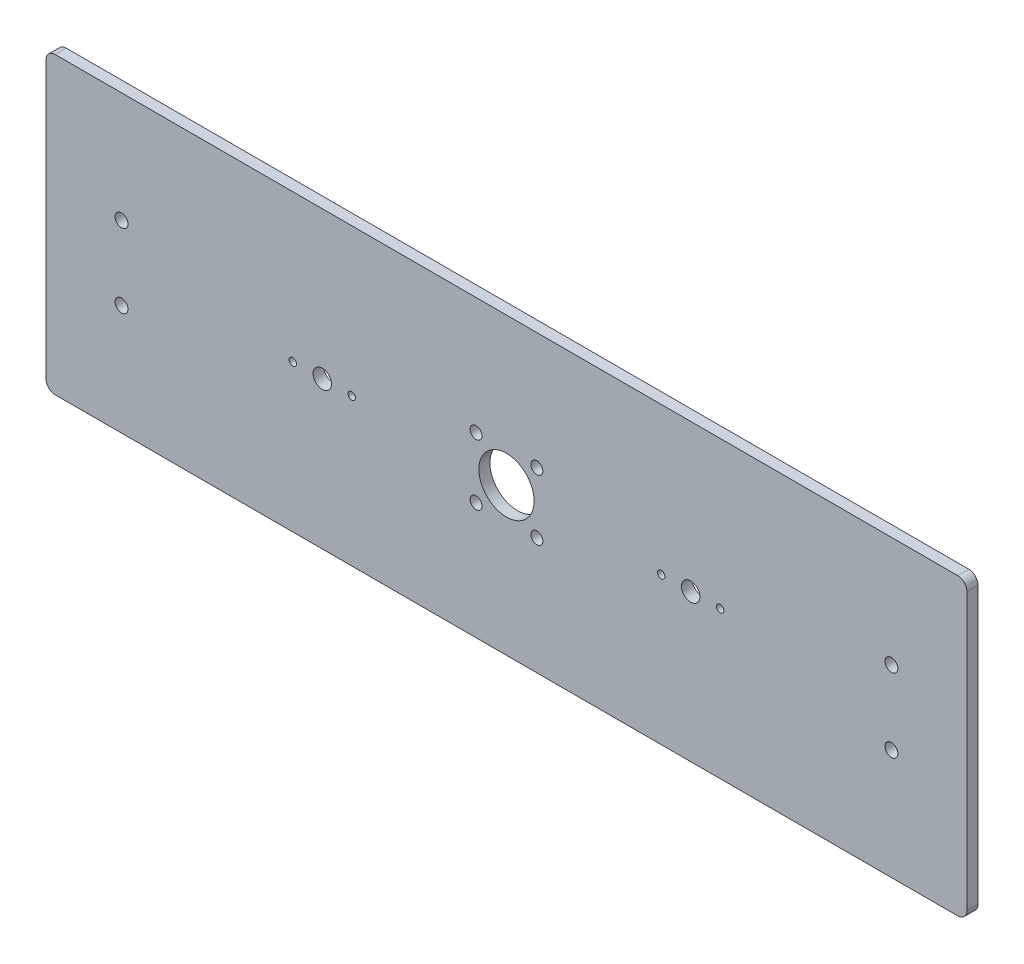
ISO-10303-21;
HEADER;
FILE_DESCRIPTION(('STEP AP214'),'2;1');
FILE_NAME('part.step','',(''),(''),'','','');
FILE_SCHEMA(('AUTOMOTIVE_DESIGN { 1 0 10303 214 1 1 1 1 }'));
ENDSEC;
DATA;
#1=APPLICATION_CONTEXT('core data for automotive mechanical design processes');
#2=APPLICATION_PROTOCOL_DEFINITION('international standard','automotive_design',2000,#1);
#3=PRODUCT_CONTEXT('',#1,'mechanical');
#4=PRODUCT('Part','Part','',(#3));
#5=PRODUCT_RELATED_PRODUCT_CATEGORY('part','',(#4));
#6=PRODUCT_DEFINITION_FORMATION('','',#4);
#7=PRODUCT_DEFINITION_CONTEXT('part definition',#1,'design');
#8=PRODUCT_DEFINITION('design','',#6,#7);
#9=PRODUCT_DEFINITION_SHAPE('','',#8);
#10=(LENGTH_UNIT() NAMED_UNIT(*) SI_UNIT(.MILLI.,.METRE.));
#11=(NAMED_UNIT(*) PLANE_ANGLE_UNIT() SI_UNIT($,.RADIAN.));
#12=(NAMED_UNIT(*) SI_UNIT($,.STERADIAN.) SOLID_ANGLE_UNIT());
#13=UNCERTAINTY_MEASURE_WITH_UNIT(LENGTH_MEASURE(1.E-05),#10,'distance_accuracy_value','');
#14=(GEOMETRIC_REPRESENTATION_CONTEXT(3) GLOBAL_UNCERTAINTY_ASSIGNED_CONTEXT((#13)) GLOBAL_UNIT_ASSIGNED_CONTEXT((#10,
#11,#12)) REPRESENTATION_CONTEXT('',''));
#15=CARTESIAN_POINT('',(0.,0.,0.));
#16=DIRECTION('',(0.,0.,1.));
#17=DIRECTION('',(1.,0.,0.));
#18=AXIS2_PLACEMENT_3D('',#15,#16,#17);
#19=CARTESIAN_POINT('',(0.,-80.,6.));
#20=DIRECTION('',(0.,1.,0.));
#21=DIRECTION('',(0.,0.,1.));
#22=AXIS2_PLACEMENT_3D('',#19,#20,#21);
#23=PLANE('',#22);
#24=DIRECTION('',(1.,0.,0.));
#25=VECTOR('',#24,1.);
#26=CARTESIAN_POINT('',(0.,-80.,6.));
#27=LINE('',#26,#25);
#28=CARTESIAN_POINT('',(-195.,-80.,6.));
#29=VERTEX_POINT('',#28);
#30=CARTESIAN_POINT('',(295.,-80.,6.));
#31=VERTEX_POINT('',#30);
#32=EDGE_CURVE('E123',#29,#31,#27,.T.);
#33=ORIENTED_EDGE('',*,*,#32,.F.);
#34=DIRECTION('',(0.,0.,-1.));
#35=VECTOR('',#34,1.);
#36=CARTESIAN_POINT('',(-195.,-80.,0.));
#37=LINE('',#36,#35);
#38=CARTESIAN_POINT('',(-195.,-80.,0.));
#39=VERTEX_POINT('',#38);
#40=EDGE_CURVE('E108',#29,#39,#37,.T.);
#41=ORIENTED_EDGE('',*,*,#40,.T.);
#42=DIRECTION('',(1.,0.,0.));
#43=VECTOR('',#42,1.);
#44=CARTESIAN_POINT('',(0.,-80.,0.));
#45=LINE('',#44,#43);
#46=CARTESIAN_POINT('',(295.,-80.,0.));
#47=VERTEX_POINT('',#46);
#48=EDGE_CURVE('E120',#39,#47,#45,.T.);
#49=ORIENTED_EDGE('',*,*,#48,.T.);
#50=DIRECTION('',(0.,0.,-1.));
#51=VECTOR('',#50,1.);
#52=CARTESIAN_POINT('',(295.,-80.,6.));
#53=LINE('',#52,#51);
#54=EDGE_CURVE('E125',#47,#31,#53,.F.);
#55=ORIENTED_EDGE('',*,*,#54,.T.);
#56=EDGE_LOOP('',(#33,#41,#49,#55));
#57=FACE_BOUND('',#56,.T.);
#58=ADVANCED_FACE('F38',(#57),#23,.F.);
#59=CARTESIAN_POINT('',(300.,0.,6.));
#60=DIRECTION('',(-1.,0.,0.));
#61=DIRECTION('',(0.,0.,1.));
#62=AXIS2_PLACEMENT_3D('',#59,#60,#61);
#63=PLANE('',#62);
#64=DIRECTION('',(0.,1.,0.));
#65=VECTOR('',#64,1.);
#66=CARTESIAN_POINT('',(300.,0.,6.));
#67=LINE('',#66,#65);
#68=CARTESIAN_POINT('',(300.,-75.,6.));
#69=VERTEX_POINT('',#68);
#70=CARTESIAN_POINT('',(300.,75.,6.));
#71=VERTEX_POINT('',#70);
#72=EDGE_CURVE('E180',#69,#71,#67,.T.);
#73=ORIENTED_EDGE('',*,*,#72,.F.);
#74=DIRECTION('',(0.,0.,-1.));
#75=VECTOR('',#74,1.);
#76=CARTESIAN_POINT('',(300.,-75.,6.));
#77=LINE('',#76,#75);
#78=CARTESIAN_POINT('',(300.,-75.,0.));
#79=VERTEX_POINT('',#78);
#80=EDGE_CURVE('E173',#69,#79,#77,.T.);
#81=ORIENTED_EDGE('',*,*,#80,.T.);
#82=DIRECTION('',(0.,1.,0.));
#83=VECTOR('',#82,1.);
#84=CARTESIAN_POINT('',(300.,0.,0.));
#85=LINE('',#84,#83);
#86=CARTESIAN_POINT('',(300.,75.,0.));
#87=VERTEX_POINT('',#86);
#88=EDGE_CURVE('E130',#79,#87,#85,.T.);
#89=ORIENTED_EDGE('',*,*,#88,.T.);
#90=DIRECTION('',(0.,0.,-1.));
#91=VECTOR('',#90,1.);
#92=CARTESIAN_POINT('',(300.,75.,6.));
#93=LINE('',#92,#91);
#94=EDGE_CURVE('E171',#87,#71,#93,.F.);
#95=ORIENTED_EDGE('',*,*,#94,.T.);
#96=EDGE_LOOP('',(#73,#81,#89,#95));
#97=FACE_BOUND('',#96,.T.);
#98=ADVANCED_FACE('F178',(#97),#63,.F.);
#99=CARTESIAN_POINT('',(0.,80.,6.));
#100=DIRECTION('',(0.,1.,0.));
#101=DIRECTION('',(0.,0.,1.));
#102=AXIS2_PLACEMENT_3D('',#99,#100,#101);
#103=PLANE('',#102);
#104=DIRECTION('',(1.,0.,0.));
#105=VECTOR('',#104,1.);
#106=CARTESIAN_POINT('',(0.,80.,6.));
#107=LINE('',#106,#105);
#108=CARTESIAN_POINT('',(-195.,80.,6.));
#109=VERTEX_POINT('',#108);
#110=CARTESIAN_POINT('',(295.,80.,6.));
#111=VERTEX_POINT('',#110);
#112=EDGE_CURVE('E187',#109,#111,#107,.T.);
#113=ORIENTED_EDGE('',*,*,#112,.T.);
#114=DIRECTION('',(0.,0.,-1.));
#115=VECTOR('',#114,1.);
#116=CARTESIAN_POINT('',(295.,80.,0.));
#117=LINE('',#116,#115);
#118=CARTESIAN_POINT('',(295.,80.,0.));
#119=VERTEX_POINT('',#118);
#120=EDGE_CURVE('E11',#111,#119,#117,.T.);
#121=ORIENTED_EDGE('',*,*,#120,.T.);
#122=DIRECTION('',(1.,0.,0.));
#123=VECTOR('',#122,1.);
#124=CARTESIAN_POINT('',(0.,80.,0.));
#125=LINE('',#124,#123);
#126=CARTESIAN_POINT('',(-195.,80.,0.));
#127=VERTEX_POINT('',#126);
#128=EDGE_CURVE('E134',#127,#119,#125,.T.);
#129=ORIENTED_EDGE('',*,*,#128,.F.);
#130=DIRECTION('',(0.,0.,-1.));
#131=VECTOR('',#130,1.);
#132=CARTESIAN_POINT('',(-195.,80.,6.));
#133=LINE('',#132,#131);
#134=EDGE_CURVE('E46',#127,#109,#133,.F.);
#135=ORIENTED_EDGE('',*,*,#134,.T.);
#136=EDGE_LOOP('',(#113,#121,#129,#135));
#137=FACE_BOUND('',#136,.T.);
#138=ADVANCED_FACE('F186',(#137),#103,.T.);
#139=CARTESIAN_POINT('',(259.,20.,6.));
#140=DIRECTION('',(0.,0.,-1.));
#141=DIRECTION('',(-1.,0.,0.));
#142=AXIS2_PLACEMENT_3D('',#139,#140,#141);
#143=CYLINDRICAL_SURFACE('',#142,3.50000000000002);
#144=CARTESIAN_POINT('',(259.,20.,6.));
#145=DIRECTION('',(0.,0.,1.));
#146=DIRECTION('',(1.,0.,0.));
#147=AXIS2_PLACEMENT_3D('',#144,#145,#146);
#148=CIRCLE('',#147,3.50000000000002);
#149=CARTESIAN_POINT('',(262.5,20.,6.));
#150=VERTEX_POINT('',#149);
#151=EDGE_CURVE('E199',#150,#150,#148,.F.);
#152=ORIENTED_EDGE('',*,*,#151,.F.);
#153=EDGE_LOOP('',(#152));
#154=FACE_BOUND('',#153,.T.);
#155=CARTESIAN_POINT('',(259.,20.,0.));
#156=DIRECTION('',(0.,0.,1.));
#157=DIRECTION('',(1.,0.,0.));
#158=AXIS2_PLACEMENT_3D('',#155,#156,#157);
#159=CIRCLE('',#158,3.50000000000002);
#160=CARTESIAN_POINT('',(262.5,20.,0.));
#161=VERTEX_POINT('',#160);
#162=EDGE_CURVE('E148',#161,#161,#159,.F.);
#163=ORIENTED_EDGE('',*,*,#162,.T.);
#164=EDGE_LOOP('',(#163));
#165=FACE_BOUND('',#164,.T.);
#166=ADVANCED_FACE('F264',(#154,#165),#143,.F.);
#167=CARTESIAN_POINT('',(259.,-20.,6.));
#168=DIRECTION('',(0.,0.,-1.));
#169=DIRECTION('',(-1.,0.,0.));
#170=AXIS2_PLACEMENT_3D('',#167,#168,#169);
#171=CYLINDRICAL_SURFACE('',#170,3.50000000000002);
#172=CARTESIAN_POINT('',(259.,-20.,6.));
#173=DIRECTION('',(0.,0.,1.));
#174=DIRECTION('',(1.,0.,0.));
#175=AXIS2_PLACEMENT_3D('',#172,#173,#174);
#176=CIRCLE('',#175,3.50000000000002);
#177=CARTESIAN_POINT('',(262.5,-20.,6.));
#178=VERTEX_POINT('',#177);
#179=EDGE_CURVE('E192',#178,#178,#176,.T.);
#180=ORIENTED_EDGE('',*,*,#179,.T.);
#181=EDGE_LOOP('',(#180));
#182=FACE_BOUND('',#181,.T.);
#183=CARTESIAN_POINT('',(259.,-20.,0.));
#184=DIRECTION('',(0.,0.,1.));
#185=DIRECTION('',(1.,0.,0.));
#186=AXIS2_PLACEMENT_3D('',#183,#184,#185);
#187=CIRCLE('',#186,3.50000000000002);
#188=CARTESIAN_POINT('',(262.5,-20.,0.));
#189=VERTEX_POINT('',#188);
#190=EDGE_CURVE('E145',#189,#189,#187,.T.);
#191=ORIENTED_EDGE('',*,*,#190,.F.);
#192=EDGE_LOOP('',(#191));
#193=FACE_BOUND('',#192,.T.);
#194=ADVANCED_FACE('F267',(#182,#193),#171,.F.);
#195=CARTESIAN_POINT('',(-200.,0.,6.));
#196=DIRECTION('',(-1.,0.,0.));
#197=DIRECTION('',(0.,0.,1.));
#198=AXIS2_PLACEMENT_3D('',#195,#196,#197);
#199=PLANE('',#198);
#200=DIRECTION('',(0.,1.,0.));
#201=VECTOR('',#200,1.);
#202=CARTESIAN_POINT('',(-200.,0.,0.));
#203=LINE('',#202,#201);
#204=CARTESIAN_POINT('',(-200.,-75.,0.));
#205=VERTEX_POINT('',#204);
#206=CARTESIAN_POINT('',(-200.,75.,0.));
#207=VERTEX_POINT('',#206);
#208=EDGE_CURVE('E143',#205,#207,#203,.T.);
#209=ORIENTED_EDGE('',*,*,#208,.F.);
#210=DIRECTION('',(0.,0.,-1.));
#211=VECTOR('',#210,1.);
#212=CARTESIAN_POINT('',(-200.,-75.,6.));
#213=LINE('',#212,#211);
#214=CARTESIAN_POINT('',(-200.,-75.,6.));
#215=VERTEX_POINT('',#214);
#216=EDGE_CURVE('E109',#205,#215,#213,.F.);
#217=ORIENTED_EDGE('',*,*,#216,.T.);
#218=DIRECTION('',(0.,1.,0.));
#219=VECTOR('',#218,1.);
#220=CARTESIAN_POINT('',(-200.,0.,6.));
#221=LINE('',#220,#219);
#222=CARTESIAN_POINT('',(-200.,75.,6.));
#223=VERTEX_POINT('',#222);
#224=EDGE_CURVE('E189',#215,#223,#221,.T.);
#225=ORIENTED_EDGE('',*,*,#224,.T.);
#226=DIRECTION('',(0.,0.,-1.));
#227=VECTOR('',#226,1.);
#228=CARTESIAN_POINT('',(-200.,75.,6.));
#229=LINE('',#228,#227);
#230=EDGE_CURVE('E114',#223,#207,#229,.T.);
#231=ORIENTED_EDGE('',*,*,#230,.T.);
#232=EDGE_LOOP('',(#209,#217,#225,#231));
#233=FACE_BOUND('',#232,.T.);
#234=ADVANCED_FACE('F251',(#233),#199,.T.);
#235=CARTESIAN_POINT('',(49.9999999999999,0.,6.));
#236=DIRECTION('',(0.,0.,-1.));
#237=DIRECTION('',(-1.,0.,0.));
#238=AXIS2_PLACEMENT_3D('',#235,#236,#237);
#239=CYLINDRICAL_SURFACE('',#238,15.);
#240=CARTESIAN_POINT('',(49.9999999999999,0.,6.));
#241=DIRECTION('',(0.,0.,1.));
#242=DIRECTION('',(1.,0.,0.));
#243=AXIS2_PLACEMENT_3D('',#240,#241,#242);
#244=CIRCLE('',#243,15.);
#245=CARTESIAN_POINT('',(64.9999999999999,0.,6.));
#246=VERTEX_POINT('',#245);
#247=EDGE_CURVE('E332',#246,#246,#244,.T.);
#248=ORIENTED_EDGE('',*,*,#247,.T.);
#249=EDGE_LOOP('',(#248));
#250=FACE_BOUND('',#249,.T.);
#251=CARTESIAN_POINT('',(49.9999999999999,0.,0.));
#252=DIRECTION('',(0.,0.,1.));
#253=DIRECTION('',(1.,0.,0.));
#254=AXIS2_PLACEMENT_3D('',#251,#252,#253);
#255=CIRCLE('',#254,15.);
#256=CARTESIAN_POINT('',(64.9999999999999,0.,0.));
#257=VERTEX_POINT('',#256);
#258=EDGE_CURVE('E131',#257,#257,#255,.T.);
#259=ORIENTED_EDGE('',*,*,#258,.F.);
#260=EDGE_LOOP('',(#259));
#261=FACE_BOUND('',#260,.T.);
#262=ADVANCED_FACE('F241',(#250,#261),#239,.F.);
#263=CARTESIAN_POINT('',(-50.,0.,6.));
#264=DIRECTION('',(0.,0.,-1.));
#265=DIRECTION('',(-1.,0.,0.));
#266=AXIS2_PLACEMENT_3D('',#263,#264,#265);
#267=CYLINDRICAL_SURFACE('',#266,5.);
#268=CARTESIAN_POINT('',(-50.,0.,6.));
#269=DIRECTION('',(0.,0.,1.));
#270=DIRECTION('',(1.,0.,0.));
#271=AXIS2_PLACEMENT_3D('',#268,#269,#270);
#272=CIRCLE('',#271,5.);
#273=CARTESIAN_POINT('',(-45.,0.,6.));
#274=VERTEX_POINT('',#273);
#275=EDGE_CURVE('E329',#274,#274,#272,.T.);
#276=ORIENTED_EDGE('',*,*,#275,.T.);
#277=EDGE_LOOP('',(#276));
#278=FACE_BOUND('',#277,.T.);
#279=CARTESIAN_POINT('',(-50.,0.,0.));
#280=DIRECTION('',(0.,0.,1.));
#281=DIRECTION('',(1.,0.,0.));
#282=AXIS2_PLACEMENT_3D('',#279,#280,#281);
#283=CIRCLE('',#282,5.);
#284=CARTESIAN_POINT('',(-45.,0.,0.));
#285=VERTEX_POINT('',#284);
#286=EDGE_CURVE('E137',#285,#285,#283,.T.);
#287=ORIENTED_EDGE('',*,*,#286,.F.);
#288=EDGE_LOOP('',(#287));
#289=FACE_BOUND('',#288,.T.);
#290=ADVANCED_FACE('F238',(#278,#289),#267,.F.);
#291=CARTESIAN_POINT('',(150.,0.,6.));
#292=DIRECTION('',(0.,0.,-1.));
#293=DIRECTION('',(-1.,0.,0.));
#294=AXIS2_PLACEMENT_3D('',#291,#292,#293);
#295=CYLINDRICAL_SURFACE('',#294,5.00000000000002);
#296=CARTESIAN_POINT('',(150.,0.,6.));
#297=DIRECTION('',(0.,0.,1.));
#298=DIRECTION('',(1.,0.,0.));
#299=AXIS2_PLACEMENT_3D('',#296,#297,#298);
#300=CIRCLE('',#299,5.00000000000002);
#301=CARTESIAN_POINT('',(155.,0.,6.));
#302=VERTEX_POINT('',#301);
#303=EDGE_CURVE('E326',#302,#302,#300,.T.);
#304=ORIENTED_EDGE('',*,*,#303,.T.);
#305=EDGE_LOOP('',(#304));
#306=FACE_BOUND('',#305,.T.);
#307=CARTESIAN_POINT('',(150.,0.,0.));
#308=DIRECTION('',(0.,0.,1.));
#309=DIRECTION('',(1.,0.,0.));
#310=AXIS2_PLACEMENT_3D('',#307,#308,#309);
#311=CIRCLE('',#310,5.00000000000002);
#312=CARTESIAN_POINT('',(155.,0.,0.));
#313=VERTEX_POINT('',#312);
#314=EDGE_CURVE('E231',#313,#313,#311,.T.);
#315=ORIENTED_EDGE('',*,*,#314,.F.);
#316=EDGE_LOOP('',(#315));
#317=FACE_BOUND('',#316,.T.);
#318=ADVANCED_FACE('F240',(#306,#317),#295,.F.);
#319=CARTESIAN_POINT('',(-159.,20.,6.));
#320=DIRECTION('',(0.,0.,-1.));
#321=DIRECTION('',(-1.,0.,0.));
#322=AXIS2_PLACEMENT_3D('',#319,#320,#321);
#323=CYLINDRICAL_SURFACE('',#322,3.49999999999999);
#324=CARTESIAN_POINT('',(-159.,20.,6.));
#325=DIRECTION('',(0.,0.,1.));
#326=DIRECTION('',(1.,0.,0.));
#327=AXIS2_PLACEMENT_3D('',#324,#325,#326);
#328=CIRCLE('',#327,3.49999999999999);
#329=CARTESIAN_POINT('',(-155.5,20.,6.));
#330=VERTEX_POINT('',#329);
#331=EDGE_CURVE('E322',#330,#330,#328,.T.);
#332=ORIENTED_EDGE('',*,*,#331,.T.);
#333=EDGE_LOOP('',(#332));
#334=FACE_BOUND('',#333,.T.);
#335=CARTESIAN_POINT('',(-159.,20.,0.));
#336=DIRECTION('',(0.,0.,1.));
#337=DIRECTION('',(1.,0.,0.));
#338=AXIS2_PLACEMENT_3D('',#335,#336,#337);
#339=CIRCLE('',#338,3.49999999999999);
#340=CARTESIAN_POINT('',(-155.5,20.,0.));
#341=VERTEX_POINT('',#340);
#342=EDGE_CURVE('E228',#341,#341,#339,.T.);
#343=ORIENTED_EDGE('',*,*,#342,.F.);
#344=EDGE_LOOP('',(#343));
#345=FACE_BOUND('',#344,.T.);
#346=ADVANCED_FACE('F248',(#334,#345),#323,.F.);
#347=CARTESIAN_POINT('',(-159.,-20.,6.));
#348=DIRECTION('',(0.,0.,-1.));
#349=DIRECTION('',(-1.,0.,0.));
#350=AXIS2_PLACEMENT_3D('',#347,#348,#349);
#351=CYLINDRICAL_SURFACE('',#350,3.49999999999999);
#352=CARTESIAN_POINT('',(-159.,-20.,6.));
#353=DIRECTION('',(0.,0.,1.));
#354=DIRECTION('',(1.,0.,0.));
#355=AXIS2_PLACEMENT_3D('',#352,#353,#354);
#356=CIRCLE('',#355,3.49999999999999);
#357=CARTESIAN_POINT('',(-155.5,-20.,6.));
#358=VERTEX_POINT('',#357);
#359=EDGE_CURVE('E318',#358,#358,#356,.F.);
#360=ORIENTED_EDGE('',*,*,#359,.F.);
#361=EDGE_LOOP('',(#360));
#362=FACE_BOUND('',#361,.T.);
#363=CARTESIAN_POINT('',(-159.,-20.,0.));
#364=DIRECTION('',(0.,0.,1.));
#365=DIRECTION('',(1.,0.,0.));
#366=AXIS2_PLACEMENT_3D('',#363,#364,#365);
#367=CIRCLE('',#366,3.49999999999999);
#368=CARTESIAN_POINT('',(-155.5,-20.,0.));
#369=VERTEX_POINT('',#368);
#370=EDGE_CURVE('E225',#369,#369,#367,.F.);
#371=ORIENTED_EDGE('',*,*,#370,.T.);
#372=EDGE_LOOP('',(#371));
#373=FACE_BOUND('',#372,.T.);
#374=ADVANCED_FACE('F388',(#362,#373),#351,.F.);
#375=CARTESIAN_POINT('',(134.,0.,6.));
#376=DIRECTION('',(0.,0.,-1.));
#377=DIRECTION('',(-1.,0.,0.));
#378=AXIS2_PLACEMENT_3D('',#375,#376,#377);
#379=CYLINDRICAL_SURFACE('',#378,2.);
#380=CARTESIAN_POINT('',(134.,0.,6.));
#381=DIRECTION('',(0.,0.,1.));
#382=DIRECTION('',(1.,0.,0.));
#383=AXIS2_PLACEMENT_3D('',#380,#381,#382);
#384=CIRCLE('',#383,2.);
#385=CARTESIAN_POINT('',(136.,0.,6.));
#386=VERTEX_POINT('',#385);
#387=EDGE_CURVE('E314',#386,#386,#384,.T.);
#388=ORIENTED_EDGE('',*,*,#387,.T.);
#389=EDGE_LOOP('',(#388));
#390=FACE_BOUND('',#389,.T.);
#391=CARTESIAN_POINT('',(134.,0.,0.));
#392=DIRECTION('',(0.,0.,1.));
#393=DIRECTION('',(1.,0.,0.));
#394=AXIS2_PLACEMENT_3D('',#391,#392,#393);
#395=CIRCLE('',#394,2.);
#396=CARTESIAN_POINT('',(136.,0.,0.));
#397=VERTEX_POINT('',#396);
#398=EDGE_CURVE('E222',#397,#397,#395,.T.);
#399=ORIENTED_EDGE('',*,*,#398,.F.);
#400=EDGE_LOOP('',(#399));
#401=FACE_BOUND('',#400,.T.);
#402=ADVANCED_FACE('F384',(#390,#401),#379,.F.);
#403=CARTESIAN_POINT('',(166.,0.,6.));
#404=DIRECTION('',(0.,0.,-1.));
#405=DIRECTION('',(-1.,0.,0.));
#406=AXIS2_PLACEMENT_3D('',#403,#404,#405);
#407=CYLINDRICAL_SURFACE('',#406,2.);
#408=CARTESIAN_POINT('',(166.,0.,6.));
#409=DIRECTION('',(0.,0.,1.));
#410=DIRECTION('',(1.,0.,0.));
#411=AXIS2_PLACEMENT_3D('',#408,#409,#410);
#412=CIRCLE('',#411,2.);
#413=CARTESIAN_POINT('',(168.,0.,6.));
#414=VERTEX_POINT('',#413);
#415=EDGE_CURVE('E310',#414,#414,#412,.T.);
#416=ORIENTED_EDGE('',*,*,#415,.T.);
#417=EDGE_LOOP('',(#416));
#418=FACE_BOUND('',#417,.T.);
#419=CARTESIAN_POINT('',(166.,0.,0.));
#420=DIRECTION('',(0.,0.,1.));
#421=DIRECTION('',(1.,0.,0.));
#422=AXIS2_PLACEMENT_3D('',#419,#420,#421);
#423=CIRCLE('',#422,2.);
#424=CARTESIAN_POINT('',(168.,0.,0.));
#425=VERTEX_POINT('',#424);
#426=EDGE_CURVE('E219',#425,#425,#423,.T.);
#427=ORIENTED_EDGE('',*,*,#426,.F.);
#428=EDGE_LOOP('',(#427));
#429=FACE_BOUND('',#428,.T.);
#430=ADVANCED_FACE('F380',(#418,#429),#407,.F.);
#431=CARTESIAN_POINT('',(-66.0000000000001,0.,6.));
#432=DIRECTION('',(0.,0.,-1.));
#433=DIRECTION('',(-1.,0.,0.));
#434=AXIS2_PLACEMENT_3D('',#431,#432,#433);
#435=CYLINDRICAL_SURFACE('',#434,2.);
#436=CARTESIAN_POINT('',(-66.0000000000001,0.,6.));
#437=DIRECTION('',(0.,0.,1.));
#438=DIRECTION('',(1.,0.,0.));
#439=AXIS2_PLACEMENT_3D('',#436,#437,#438);
#440=CIRCLE('',#439,2.);
#441=CARTESIAN_POINT('',(-64.0000000000001,0.,6.));
#442=VERTEX_POINT('',#441);
#443=EDGE_CURVE('E306',#442,#442,#440,.F.);
#444=ORIENTED_EDGE('',*,*,#443,.F.);
#445=EDGE_LOOP('',(#444));
#446=FACE_BOUND('',#445,.T.);
#447=CARTESIAN_POINT('',(-66.0000000000001,0.,0.));
#448=DIRECTION('',(0.,0.,1.));
#449=DIRECTION('',(1.,0.,0.));
#450=AXIS2_PLACEMENT_3D('',#447,#448,#449);
#451=CIRCLE('',#450,2.);
#452=CARTESIAN_POINT('',(-64.0000000000001,0.,0.));
#453=VERTEX_POINT('',#452);
#454=EDGE_CURVE('E216',#453,#453,#451,.F.);
#455=ORIENTED_EDGE('',*,*,#454,.T.);
#456=EDGE_LOOP('',(#455));
#457=FACE_BOUND('',#456,.T.);
#458=ADVANCED_FACE('F376',(#446,#457),#435,.F.);
#459=CARTESIAN_POINT('',(66.4999999999998,16.5000000000001,6.));
#460=DIRECTION('',(0.,0.,-1.));
#461=DIRECTION('',(-1.,0.,0.));
#462=AXIS2_PLACEMENT_3D('',#459,#460,#461);
#463=CYLINDRICAL_SURFACE('',#462,3.25000000000001);
#464=CARTESIAN_POINT('',(66.4999999999998,16.5000000000001,6.));
#465=DIRECTION('',(0.,0.,1.));
#466=DIRECTION('',(1.,0.,0.));
#467=AXIS2_PLACEMENT_3D('',#464,#465,#466);
#468=CIRCLE('',#467,3.25000000000001);
#469=CARTESIAN_POINT('',(69.7499999999998,16.5000000000001,6.));
#470=VERTEX_POINT('',#469);
#471=EDGE_CURVE('E302',#470,#470,#468,.T.);
#472=ORIENTED_EDGE('',*,*,#471,.T.);
#473=EDGE_LOOP('',(#472));
#474=FACE_BOUND('',#473,.T.);
#475=CARTESIAN_POINT('',(66.4999999999998,16.5000000000001,0.));
#476=DIRECTION('',(0.,0.,1.));
#477=DIRECTION('',(1.,0.,0.));
#478=AXIS2_PLACEMENT_3D('',#475,#476,#477);
#479=CIRCLE('',#478,3.25000000000001);
#480=CARTESIAN_POINT('',(69.7499999999998,16.5000000000001,0.));
#481=VERTEX_POINT('',#480);
#482=EDGE_CURVE('E213',#481,#481,#479,.T.);
#483=ORIENTED_EDGE('',*,*,#482,.F.);
#484=EDGE_LOOP('',(#483));
#485=FACE_BOUND('',#484,.T.);
#486=ADVANCED_FACE('F372',(#474,#485),#463,.F.);
#487=CARTESIAN_POINT('',(33.4999999999998,16.5000000000001,6.));
#488=DIRECTION('',(0.,0.,-1.));
#489=DIRECTION('',(-1.,0.,0.));
#490=AXIS2_PLACEMENT_3D('',#487,#488,#489);
#491=CYLINDRICAL_SURFACE('',#490,3.25);
#492=CARTESIAN_POINT('',(33.4999999999998,16.5000000000001,6.));
#493=DIRECTION('',(0.,0.,1.));
#494=DIRECTION('',(1.,0.,0.));
#495=AXIS2_PLACEMENT_3D('',#492,#493,#494);
#496=CIRCLE('',#495,3.25);
#497=CARTESIAN_POINT('',(36.7499999999998,16.5000000000001,6.));
#498=VERTEX_POINT('',#497);
#499=EDGE_CURVE('E298',#498,#498,#496,.T.);
#500=ORIENTED_EDGE('',*,*,#499,.T.);
#501=EDGE_LOOP('',(#500));
#502=FACE_BOUND('',#501,.T.);
#503=CARTESIAN_POINT('',(33.4999999999998,16.5000000000001,0.));
#504=DIRECTION('',(0.,0.,1.));
#505=DIRECTION('',(1.,0.,0.));
#506=AXIS2_PLACEMENT_3D('',#503,#504,#505);
#507=CIRCLE('',#506,3.25);
#508=CARTESIAN_POINT('',(36.7499999999998,16.5000000000001,0.));
#509=VERTEX_POINT('',#508);
#510=EDGE_CURVE('E210',#509,#509,#507,.T.);
#511=ORIENTED_EDGE('',*,*,#510,.F.);
#512=EDGE_LOOP('',(#511));
#513=FACE_BOUND('',#512,.T.);
#514=ADVANCED_FACE('F368',(#502,#513),#491,.F.);
#515=CARTESIAN_POINT('',(33.4999999999998,-16.4999999999999,6.));
#516=DIRECTION('',(0.,0.,-1.));
#517=DIRECTION('',(-1.,0.,0.));
#518=AXIS2_PLACEMENT_3D('',#515,#516,#517);
#519=CYLINDRICAL_SURFACE('',#518,3.25);
#520=CARTESIAN_POINT('',(33.4999999999998,-16.4999999999999,6.));
#521=DIRECTION('',(0.,0.,1.));
#522=DIRECTION('',(1.,0.,0.));
#523=AXIS2_PLACEMENT_3D('',#520,#521,#522);
#524=CIRCLE('',#523,3.25);
#525=CARTESIAN_POINT('',(36.7499999999998,-16.4999999999999,6.));
#526=VERTEX_POINT('',#525);
#527=EDGE_CURVE('E294',#526,#526,#524,.T.);
#528=ORIENTED_EDGE('',*,*,#527,.T.);
#529=EDGE_LOOP('',(#528));
#530=FACE_BOUND('',#529,.T.);
#531=CARTESIAN_POINT('',(33.4999999999998,-16.4999999999999,0.));
#532=DIRECTION('',(0.,0.,1.));
#533=DIRECTION('',(1.,0.,0.));
#534=AXIS2_PLACEMENT_3D('',#531,#532,#533);
#535=CIRCLE('',#534,3.25);
#536=CARTESIAN_POINT('',(36.7499999999998,-16.4999999999999,0.));
#537=VERTEX_POINT('',#536);
#538=EDGE_CURVE('E207',#537,#537,#535,.T.);
#539=ORIENTED_EDGE('',*,*,#538,.F.);
#540=EDGE_LOOP('',(#539));
#541=FACE_BOUND('',#540,.T.);
#542=ADVANCED_FACE('F364',(#530,#541),#519,.F.);
#543=CARTESIAN_POINT('',(66.4999999999998,-16.4999999999999,6.));
#544=DIRECTION('',(0.,0.,-1.));
#545=DIRECTION('',(-1.,0.,0.));
#546=AXIS2_PLACEMENT_3D('',#543,#544,#545);
#547=CYLINDRICAL_SURFACE('',#546,3.25000000000001);
#548=CARTESIAN_POINT('',(66.4999999999998,-16.4999999999999,6.));
#549=DIRECTION('',(0.,0.,1.));
#550=DIRECTION('',(1.,0.,0.));
#551=AXIS2_PLACEMENT_3D('',#548,#549,#550);
#552=CIRCLE('',#551,3.25000000000001);
#553=CARTESIAN_POINT('',(69.7499999999998,-16.4999999999999,6.));
#554=VERTEX_POINT('',#553);
#555=EDGE_CURVE('E154',#554,#554,#552,.T.);
#556=ORIENTED_EDGE('',*,*,#555,.T.);
#557=EDGE_LOOP('',(#556));
#558=FACE_BOUND('',#557,.T.);
#559=CARTESIAN_POINT('',(66.4999999999998,-16.4999999999999,0.));
#560=DIRECTION('',(0.,0.,1.));
#561=DIRECTION('',(1.,0.,0.));
#562=AXIS2_PLACEMENT_3D('',#559,#560,#561);
#563=CIRCLE('',#562,3.25000000000001);
#564=CARTESIAN_POINT('',(69.7499999999998,-16.4999999999999,0.));
#565=VERTEX_POINT('',#564);
#566=EDGE_CURVE('E204',#565,#565,#563,.T.);
#567=ORIENTED_EDGE('',*,*,#566,.F.);
#568=EDGE_LOOP('',(#567));
#569=FACE_BOUND('',#568,.T.);
#570=ADVANCED_FACE('F279',(#558,#569),#547,.F.);
#571=CARTESIAN_POINT('',(-34.0000000000001,0.,6.));
#572=DIRECTION('',(0.,0.,-1.));
#573=DIRECTION('',(-1.,0.,0.));
#574=AXIS2_PLACEMENT_3D('',#571,#572,#573);
#575=CYLINDRICAL_SURFACE('',#574,2.);
#576=CARTESIAN_POINT('',(-34.0000000000001,0.,6.));
#577=DIRECTION('',(0.,0.,1.));
#578=DIRECTION('',(1.,0.,0.));
#579=AXIS2_PLACEMENT_3D('',#576,#577,#578);
#580=CIRCLE('',#579,2.);
#581=CARTESIAN_POINT('',(-32.0000000000001,0.,6.));
#582=VERTEX_POINT('',#581);
#583=EDGE_CURVE('E155',#582,#582,#580,.F.);
#584=ORIENTED_EDGE('',*,*,#583,.F.);
#585=EDGE_LOOP('',(#584));
#586=FACE_BOUND('',#585,.T.);
#587=CARTESIAN_POINT('',(-34.0000000000001,0.,0.));
#588=DIRECTION('',(0.,0.,1.));
#589=DIRECTION('',(1.,0.,0.));
#590=AXIS2_PLACEMENT_3D('',#587,#588,#589);
#591=CIRCLE('',#590,2.);
#592=CARTESIAN_POINT('',(-32.0000000000001,0.,0.));
#593=VERTEX_POINT('',#592);
#594=EDGE_CURVE('E151',#593,#593,#591,.F.);
#595=ORIENTED_EDGE('',*,*,#594,.T.);
#596=EDGE_LOOP('',(#595));
#597=FACE_BOUND('',#596,.T.);
#598=ADVANCED_FACE('F275',(#586,#597),#575,.F.);
#599=CARTESIAN_POINT('',(0.,0.,6.));
#600=DIRECTION('',(0.,0.,1.));
#601=DIRECTION('',(1.,0.,0.));
#602=AXIS2_PLACEMENT_3D('',#599,#600,#601);
#603=PLANE('',#602);
#604=ORIENTED_EDGE('',*,*,#555,.F.);
#605=EDGE_LOOP('',(#604));
#606=FACE_BOUND('',#605,.T.);
#607=ORIENTED_EDGE('',*,*,#527,.F.);
#608=EDGE_LOOP('',(#607));
#609=FACE_BOUND('',#608,.T.);
#610=ORIENTED_EDGE('',*,*,#499,.F.);
#611=EDGE_LOOP('',(#610));
#612=FACE_BOUND('',#611,.T.);
#613=ORIENTED_EDGE('',*,*,#471,.F.);
#614=EDGE_LOOP('',(#613));
#615=FACE_BOUND('',#614,.T.);
#616=ORIENTED_EDGE('',*,*,#443,.T.);
#617=EDGE_LOOP('',(#616));
#618=FACE_BOUND('',#617,.T.);
#619=ORIENTED_EDGE('',*,*,#415,.F.);
#620=EDGE_LOOP('',(#619));
#621=FACE_BOUND('',#620,.T.);
#622=ORIENTED_EDGE('',*,*,#387,.F.);
#623=EDGE_LOOP('',(#622));
#624=FACE_BOUND('',#623,.T.);
#625=ORIENTED_EDGE('',*,*,#359,.T.);
#626=EDGE_LOOP('',(#625));
#627=FACE_BOUND('',#626,.T.);
#628=ORIENTED_EDGE('',*,*,#331,.F.);
#629=EDGE_LOOP('',(#628));
#630=FACE_BOUND('',#629,.T.);
#631=ORIENTED_EDGE('',*,*,#303,.F.);
#632=EDGE_LOOP('',(#631));
#633=FACE_BOUND('',#632,.T.);
#634=ORIENTED_EDGE('',*,*,#275,.F.);
#635=EDGE_LOOP('',(#634));
#636=FACE_BOUND('',#635,.T.);
#637=ORIENTED_EDGE('',*,*,#247,.F.);
#638=EDGE_LOOP('',(#637));
#639=FACE_BOUND('',#638,.T.);
#640=ORIENTED_EDGE('',*,*,#224,.F.);
#641=CARTESIAN_POINT('',(-195.,-75.,6.));
#642=DIRECTION('',(0.,0.,1.));
#643=DIRECTION('',(1.,0.,0.));
#644=AXIS2_PLACEMENT_3D('',#641,#642,#643);
#645=CIRCLE('',#644,5.);
#646=EDGE_CURVE('E169',#215,#29,#645,.T.);
#647=ORIENTED_EDGE('',*,*,#646,.T.);
#648=ORIENTED_EDGE('',*,*,#32,.T.);
#649=CARTESIAN_POINT('',(295.,-75.,6.));
#650=DIRECTION('',(0.,0.,1.));
#651=DIRECTION('',(1.,0.,0.));
#652=AXIS2_PLACEMENT_3D('',#649,#650,#651);
#653=CIRCLE('',#652,5.);
#654=EDGE_CURVE('E167',#31,#69,#653,.T.);
#655=ORIENTED_EDGE('',*,*,#654,.T.);
#656=ORIENTED_EDGE('',*,*,#72,.T.);
#657=CARTESIAN_POINT('',(295.,75.,6.));
#658=DIRECTION('',(0.,0.,1.));
#659=DIRECTION('',(1.,0.,0.));
#660=AXIS2_PLACEMENT_3D('',#657,#658,#659);
#661=CIRCLE('',#660,5.);
#662=EDGE_CURVE('E53',#71,#111,#661,.T.);
#663=ORIENTED_EDGE('',*,*,#662,.T.);
#664=ORIENTED_EDGE('',*,*,#112,.F.);
#665=CARTESIAN_POINT('',(-195.,75.,6.));
#666=DIRECTION('',(0.,0.,1.));
#667=DIRECTION('',(1.,0.,0.));
#668=AXIS2_PLACEMENT_3D('',#665,#666,#667);
#669=CIRCLE('',#668,5.);
#670=EDGE_CURVE('E164',#109,#223,#669,.T.);
#671=ORIENTED_EDGE('',*,*,#670,.T.);
#672=EDGE_LOOP('',(#640,#647,#648,#655,#656,#663,#664,#671));
#673=FACE_BOUND('',#672,.T.);
#674=ORIENTED_EDGE('',*,*,#179,.F.);
#675=EDGE_LOOP('',(#674));
#676=FACE_BOUND('',#675,.T.);
#677=ORIENTED_EDGE('',*,*,#151,.T.);
#678=EDGE_LOOP('',(#677));
#679=FACE_BOUND('',#678,.T.);
#680=ORIENTED_EDGE('',*,*,#583,.T.);
#681=EDGE_LOOP('',(#680));
#682=FACE_BOUND('',#681,.T.);
#683=ADVANCED_FACE('F278',(#606,#609,#612,#615,#618,#621,#624,#627,#630,#633,#636,#639,#673,
#676,#679,#682),#603,.T.);
#684=CARTESIAN_POINT('',(0.,0.,0.));
#685=DIRECTION('',(0.,0.,1.));
#686=DIRECTION('',(1.,0.,0.));
#687=AXIS2_PLACEMENT_3D('',#684,#685,#686);
#688=PLANE('',#687);
#689=ORIENTED_EDGE('',*,*,#566,.T.);
#690=EDGE_LOOP('',(#689));
#691=FACE_BOUND('',#690,.T.);
#692=ORIENTED_EDGE('',*,*,#538,.T.);
#693=EDGE_LOOP('',(#692));
#694=FACE_BOUND('',#693,.T.);
#695=ORIENTED_EDGE('',*,*,#510,.T.);
#696=EDGE_LOOP('',(#695));
#697=FACE_BOUND('',#696,.T.);
#698=ORIENTED_EDGE('',*,*,#482,.T.);
#699=EDGE_LOOP('',(#698));
#700=FACE_BOUND('',#699,.T.);
#701=ORIENTED_EDGE('',*,*,#454,.F.);
#702=EDGE_LOOP('',(#701));
#703=FACE_BOUND('',#702,.T.);
#704=ORIENTED_EDGE('',*,*,#426,.T.);
#705=EDGE_LOOP('',(#704));
#706=FACE_BOUND('',#705,.T.);
#707=ORIENTED_EDGE('',*,*,#398,.T.);
#708=EDGE_LOOP('',(#707));
#709=FACE_BOUND('',#708,.T.);
#710=ORIENTED_EDGE('',*,*,#370,.F.);
#711=EDGE_LOOP('',(#710));
#712=FACE_BOUND('',#711,.T.);
#713=ORIENTED_EDGE('',*,*,#342,.T.);
#714=EDGE_LOOP('',(#713));
#715=FACE_BOUND('',#714,.T.);
#716=ORIENTED_EDGE('',*,*,#314,.T.);
#717=EDGE_LOOP('',(#716));
#718=FACE_BOUND('',#717,.T.);
#719=ORIENTED_EDGE('',*,*,#286,.T.);
#720=EDGE_LOOP('',(#719));
#721=FACE_BOUND('',#720,.T.);
#722=ORIENTED_EDGE('',*,*,#258,.T.);
#723=EDGE_LOOP('',(#722));
#724=FACE_BOUND('',#723,.T.);
#725=ORIENTED_EDGE('',*,*,#48,.F.);
#726=CARTESIAN_POINT('',(-195.,-75.,0.));
#727=DIRECTION('',(0.,0.,1.));
#728=DIRECTION('',(1.,0.,0.));
#729=AXIS2_PLACEMENT_3D('',#726,#727,#728);
#730=CIRCLE('',#729,5.);
#731=EDGE_CURVE('E104',#39,#205,#730,.F.);
#732=ORIENTED_EDGE('',*,*,#731,.T.);
#733=ORIENTED_EDGE('',*,*,#208,.T.);
#734=CARTESIAN_POINT('',(-195.,75.,0.));
#735=DIRECTION('',(0.,0.,1.));
#736=DIRECTION('',(1.,0.,0.));
#737=AXIS2_PLACEMENT_3D('',#734,#735,#736);
#738=CIRCLE('',#737,5.);
#739=EDGE_CURVE('E124',#207,#127,#738,.F.);
#740=ORIENTED_EDGE('',*,*,#739,.T.);
#741=ORIENTED_EDGE('',*,*,#128,.T.);
#742=CARTESIAN_POINT('',(295.,75.,0.));
#743=DIRECTION('',(0.,0.,1.));
#744=DIRECTION('',(1.,0.,0.));
#745=AXIS2_PLACEMENT_3D('',#742,#743,#744);
#746=CIRCLE('',#745,5.);
#747=EDGE_CURVE('E158',#119,#87,#746,.F.);
#748=ORIENTED_EDGE('',*,*,#747,.T.);
#749=ORIENTED_EDGE('',*,*,#88,.F.);
#750=CARTESIAN_POINT('',(295.,-75.,0.));
#751=DIRECTION('',(0.,0.,1.));
#752=DIRECTION('',(1.,0.,0.));
#753=AXIS2_PLACEMENT_3D('',#750,#751,#752);
#754=CIRCLE('',#753,5.);
#755=EDGE_CURVE('E115',#79,#47,#754,.F.);
#756=ORIENTED_EDGE('',*,*,#755,.T.);
#757=EDGE_LOOP('',(#725,#732,#733,#740,#741,#748,#749,#756));
#758=FACE_BOUND('',#757,.T.);
#759=ORIENTED_EDGE('',*,*,#190,.T.);
#760=EDGE_LOOP('',(#759));
#761=FACE_BOUND('',#760,.T.);
#762=ORIENTED_EDGE('',*,*,#162,.F.);
#763=EDGE_LOOP('',(#762));
#764=FACE_BOUND('',#763,.T.);
#765=ORIENTED_EDGE('',*,*,#594,.F.);
#766=EDGE_LOOP('',(#765));
#767=FACE_BOUND('',#766,.T.);
#768=ADVANCED_FACE('F127',(#691,#694,#697,#700,#703,#706,#709,#712,#715,#718,#721,#724,#758,
#761,#764,#767),#688,.F.);
#769=CARTESIAN_POINT('',(-195.,-75.,6.));
#770=DIRECTION('',(0.,0.,1.));
#771=DIRECTION('',(1.,0.,0.));
#772=AXIS2_PLACEMENT_3D('',#769,#770,#771);
#773=CYLINDRICAL_SURFACE('',#772,5.);
#774=ORIENTED_EDGE('',*,*,#646,.F.);
#775=ORIENTED_EDGE('',*,*,#216,.F.);
#776=ORIENTED_EDGE('',*,*,#731,.F.);
#777=ORIENTED_EDGE('',*,*,#40,.F.);
#778=EDGE_LOOP('',(#774,#775,#776,#777));
#779=FACE_BOUND('',#778,.T.);
#780=ADVANCED_FACE('F107',(#779),#773,.T.);
#781=CARTESIAN_POINT('',(295.,-75.,6.));
#782=DIRECTION('',(0.,0.,-1.));
#783=DIRECTION('',(-1.,0.,0.));
#784=AXIS2_PLACEMENT_3D('',#781,#782,#783);
#785=CYLINDRICAL_SURFACE('',#784,5.);
#786=ORIENTED_EDGE('',*,*,#654,.F.);
#787=ORIENTED_EDGE('',*,*,#54,.F.);
#788=ORIENTED_EDGE('',*,*,#755,.F.);
#789=ORIENTED_EDGE('',*,*,#80,.F.);
#790=EDGE_LOOP('',(#786,#787,#788,#789));
#791=FACE_BOUND('',#790,.T.);
#792=ADVANCED_FACE('F354',(#791),#785,.T.);
#793=CARTESIAN_POINT('',(295.,75.,6.));
#794=DIRECTION('',(0.,0.,1.));
#795=DIRECTION('',(1.,0.,0.));
#796=AXIS2_PLACEMENT_3D('',#793,#794,#795);
#797=CYLINDRICAL_SURFACE('',#796,5.);
#798=ORIENTED_EDGE('',*,*,#662,.F.);
#799=ORIENTED_EDGE('',*,*,#94,.F.);
#800=ORIENTED_EDGE('',*,*,#747,.F.);
#801=ORIENTED_EDGE('',*,*,#120,.F.);
#802=EDGE_LOOP('',(#798,#799,#800,#801));
#803=FACE_BOUND('',#802,.T.);
#804=ADVANCED_FACE('F185',(#803),#797,.T.);
#805=CARTESIAN_POINT('',(-195.,75.,6.));
#806=DIRECTION('',(0.,0.,-1.));
#807=DIRECTION('',(-1.,0.,0.));
#808=AXIS2_PLACEMENT_3D('',#805,#806,#807);
#809=CYLINDRICAL_SURFACE('',#808,5.);
#810=ORIENTED_EDGE('',*,*,#670,.F.);
#811=ORIENTED_EDGE('',*,*,#134,.F.);
#812=ORIENTED_EDGE('',*,*,#739,.F.);
#813=ORIENTED_EDGE('',*,*,#230,.F.);
#814=EDGE_LOOP('',(#810,#811,#812,#813));
#815=FACE_BOUND('',#814,.T.);
#816=ADVANCED_FACE('F40',(#815),#809,.T.);
#817=CLOSED_SHELL('',(#58,#98,#138,#166,#194,#234,#262,#290,#318,#346,#374,#402,#430,#458,#486,
#514,#542,#570,#598,#683,#768,#780,#792,#804,#816));
#818=MANIFOLD_SOLID_BREP('B2',#817);
#819=ADVANCED_BREP_SHAPE_REPRESENTATION('',(#18,#818),#14);
#820=SHAPE_DEFINITION_REPRESENTATION(#9,#819);
ENDSEC;
END-ISO-10303-21;
